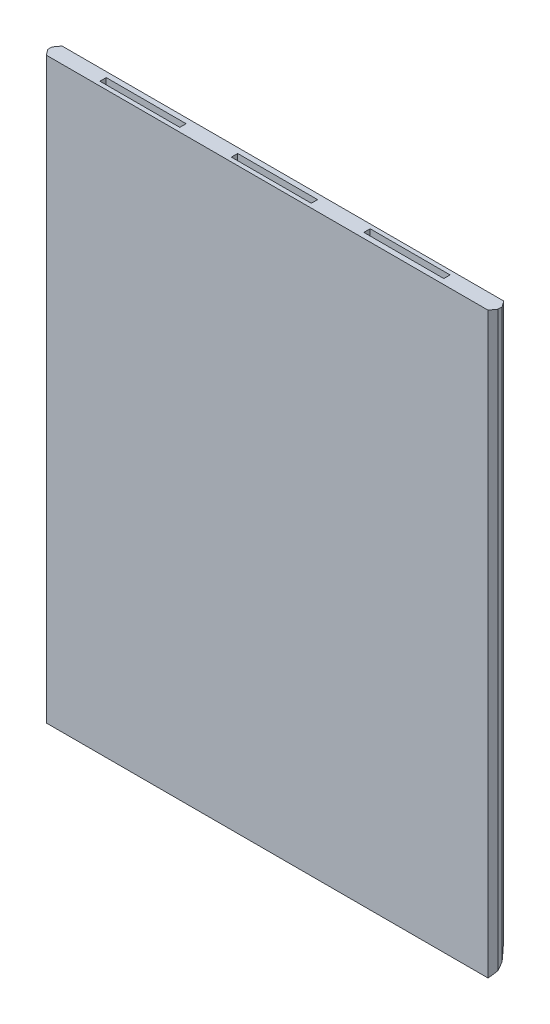
ISO-10303-21;
HEADER;
FILE_DESCRIPTION(('STEP AP214'),'2;1');
FILE_NAME('part.step','',(''),(''),'','','');
FILE_SCHEMA(('AUTOMOTIVE_DESIGN { 1 0 10303 214 1 1 1 1 }'));
ENDSEC;
DATA;
#1=APPLICATION_CONTEXT('core data for automotive mechanical design processes');
#2=APPLICATION_PROTOCOL_DEFINITION('international standard','automotive_design',2000,#1);
#3=PRODUCT_CONTEXT('',#1,'mechanical');
#4=PRODUCT('Part','Part','',(#3));
#5=PRODUCT_RELATED_PRODUCT_CATEGORY('part','',(#4));
#6=PRODUCT_DEFINITION_FORMATION('','',#4);
#7=PRODUCT_DEFINITION_CONTEXT('part definition',#1,'design');
#8=PRODUCT_DEFINITION('design','',#6,#7);
#9=PRODUCT_DEFINITION_SHAPE('','',#8);
#10=(LENGTH_UNIT() NAMED_UNIT(*) SI_UNIT(.MILLI.,.METRE.));
#11=(NAMED_UNIT(*) PLANE_ANGLE_UNIT() SI_UNIT($,.RADIAN.));
#12=(NAMED_UNIT(*) SI_UNIT($,.STERADIAN.) SOLID_ANGLE_UNIT());
#13=UNCERTAINTY_MEASURE_WITH_UNIT(LENGTH_MEASURE(1.E-05),#10,'distance_accuracy_value','');
#14=(GEOMETRIC_REPRESENTATION_CONTEXT(3) GLOBAL_UNCERTAINTY_ASSIGNED_CONTEXT((#13)) GLOBAL_UNIT_ASSIGNED_CONTEXT((#10,
#11,#12)) REPRESENTATION_CONTEXT('',''));
#15=CARTESIAN_POINT('',(0.,0.,0.));
#16=DIRECTION('',(0.,0.,1.));
#17=DIRECTION('',(1.,0.,0.));
#18=AXIS2_PLACEMENT_3D('',#15,#16,#17);
#19=CARTESIAN_POINT('',(0.,110.,0.));
#20=DIRECTION('',(0.,1.,0.));
#21=DIRECTION('',(0.,0.,1.));
#22=AXIS2_PLACEMENT_3D('',#19,#20,#21);
#23=PLANE('',#22);
#24=DIRECTION('',(0.,0.,1.));
#25=VECTOR('',#24,1.);
#26=CARTESIAN_POINT('',(-33.4,110.,-44.7999999999999));
#27=LINE('',#26,#25);
#28=CARTESIAN_POINT('',(-33.4,110.,-44.7999999999999));
#29=VERTEX_POINT('',#28);
#30=CARTESIAN_POINT('',(-33.4,110.,-43.5999999999999));
#31=VERTEX_POINT('',#30);
#32=EDGE_CURVE('E54',#29,#31,#27,.T.);
#33=ORIENTED_EDGE('',*,*,#32,.F.);
#34=DIRECTION('',(-1.,0.,0.));
#35=VECTOR('',#34,1.);
#36=CARTESIAN_POINT('',(-33.4,110.,-44.7999999999999));
#37=LINE('',#36,#35);
#38=CARTESIAN_POINT('',(-18.2,110.,-44.7999999999999));
#39=VERTEX_POINT('',#38);
#40=EDGE_CURVE('E199',#39,#29,#37,.T.);
#41=ORIENTED_EDGE('',*,*,#40,.F.);
#42=DIRECTION('',(0.,0.,-1.));
#43=VECTOR('',#42,1.);
#44=CARTESIAN_POINT('',(-18.2,110.,-44.7999999999999));
#45=LINE('',#44,#43);
#46=CARTESIAN_POINT('',(-18.2,110.,-43.5999999999999));
#47=VERTEX_POINT('',#46);
#48=EDGE_CURVE('E205',#47,#39,#45,.T.);
#49=ORIENTED_EDGE('',*,*,#48,.F.);
#50=DIRECTION('',(1.,0.,0.));
#51=VECTOR('',#50,1.);
#52=CARTESIAN_POINT('',(-33.4,110.,-43.5999999999999));
#53=LINE('',#52,#51);
#54=EDGE_CURVE('E214',#31,#47,#53,.T.);
#55=ORIENTED_EDGE('',*,*,#54,.F.);
#56=EDGE_LOOP('',(#33,#41,#49,#55));
#57=FACE_BOUND('',#56,.T.);
#58=DIRECTION('',(0.,0.,1.));
#59=VECTOR('',#58,1.);
#60=CARTESIAN_POINT('',(-8.40000000000001,110.,-44.7999999999999));
#61=LINE('',#60,#59);
#62=CARTESIAN_POINT('',(-8.40000000000001,110.,-44.7999999999999));
#63=VERTEX_POINT('',#62);
#64=CARTESIAN_POINT('',(-8.40000000000001,110.,-43.5999999999999));
#65=VERTEX_POINT('',#64);
#66=EDGE_CURVE('E62',#63,#65,#61,.T.);
#67=ORIENTED_EDGE('',*,*,#66,.F.);
#68=DIRECTION('',(-1.,0.,0.));
#69=VECTOR('',#68,1.);
#70=CARTESIAN_POINT('',(-8.40000000000001,110.,-44.7999999999999));
#71=LINE('',#70,#69);
#72=CARTESIAN_POINT('',(6.79999999999999,110.,-44.7999999999999));
#73=VERTEX_POINT('',#72);
#74=EDGE_CURVE('E235',#73,#63,#71,.T.);
#75=ORIENTED_EDGE('',*,*,#74,.F.);
#76=DIRECTION('',(0.,0.,-1.));
#77=VECTOR('',#76,1.);
#78=CARTESIAN_POINT('',(6.79999999999999,110.,-44.7999999999999));
#79=LINE('',#78,#77);
#80=CARTESIAN_POINT('',(6.79999999999999,110.,-43.5999999999999));
#81=VERTEX_POINT('',#80);
#82=EDGE_CURVE('E255',#81,#73,#79,.T.);
#83=ORIENTED_EDGE('',*,*,#82,.F.);
#84=DIRECTION('',(1.,0.,0.));
#85=VECTOR('',#84,1.);
#86=CARTESIAN_POINT('',(-8.40000000000001,110.,-43.5999999999999));
#87=LINE('',#86,#85);
#88=EDGE_CURVE('E250',#65,#81,#87,.T.);
#89=ORIENTED_EDGE('',*,*,#88,.F.);
#90=EDGE_LOOP('',(#67,#75,#83,#89));
#91=FACE_BOUND('',#90,.T.);
#92=DIRECTION('',(0.,0.,1.));
#93=VECTOR('',#92,1.);
#94=CARTESIAN_POINT('',(16.6,110.,-45.0000000000001));
#95=LINE('',#94,#93);
#96=CARTESIAN_POINT('',(16.6,110.,-45.0000000000001));
#97=VERTEX_POINT('',#96);
#98=CARTESIAN_POINT('',(16.6,110.,-43.8000000000001));
#99=VERTEX_POINT('',#98);
#100=EDGE_CURVE('E289',#97,#99,#95,.T.);
#101=ORIENTED_EDGE('',*,*,#100,.F.);
#102=DIRECTION('',(-1.,0.,0.));
#103=VECTOR('',#102,1.);
#104=CARTESIAN_POINT('',(16.6,110.,-45.0000000000001));
#105=LINE('',#104,#103);
#106=CARTESIAN_POINT('',(31.8,110.,-45.0000000000001));
#107=VERTEX_POINT('',#106);
#108=EDGE_CURVE('E276',#107,#97,#105,.T.);
#109=ORIENTED_EDGE('',*,*,#108,.F.);
#110=DIRECTION('',(0.,0.,-1.));
#111=VECTOR('',#110,1.);
#112=CARTESIAN_POINT('',(31.8,110.,-45.0000000000001));
#113=LINE('',#112,#111);
#114=CARTESIAN_POINT('',(31.8,110.,-43.8000000000001));
#115=VERTEX_POINT('',#114);
#116=EDGE_CURVE('E296',#115,#107,#113,.T.);
#117=ORIENTED_EDGE('',*,*,#116,.F.);
#118=DIRECTION('',(1.,0.,0.));
#119=VECTOR('',#118,1.);
#120=CARTESIAN_POINT('',(16.6,110.,-43.8000000000001));
#121=LINE('',#120,#119);
#122=EDGE_CURVE('E292',#99,#115,#121,.T.);
#123=ORIENTED_EDGE('',*,*,#122,.F.);
#124=EDGE_LOOP('',(#101,#109,#117,#123));
#125=FACE_BOUND('',#124,.T.);
#126=DIRECTION('',(0.588171697675053,0.,0.808736084303183));
#127=VECTOR('',#126,1.);
#128=CARTESIAN_POINT('',(-42.8,110.,-42.7999999999999));
#129=LINE('',#128,#127);
#130=CARTESIAN_POINT('',(-43.6,110.,-43.8999999999999));
#131=VERTEX_POINT('',#130);
#132=CARTESIAN_POINT('',(-42.8,110.,-42.7999999999999));
#133=VERTEX_POINT('',#132);
#134=EDGE_CURVE('E224',#131,#133,#129,.T.);
#135=ORIENTED_EDGE('',*,*,#134,.T.);
#136=DIRECTION('',(1.,0.,0.));
#137=VECTOR('',#136,1.);
#138=CARTESIAN_POINT('',(41.2,110.,-42.8000000000002));
#139=LINE('',#138,#137);
#140=CARTESIAN_POINT('',(41.2,110.,-42.8000000000002));
#141=VERTEX_POINT('',#140);
#142=EDGE_CURVE('E318',#133,#141,#139,.T.);
#143=ORIENTED_EDGE('',*,*,#142,.T.);
#144=DIRECTION('',(0.588171697675045,0.,-0.80873608430319));
#145=VECTOR('',#144,1.);
#146=CARTESIAN_POINT('',(41.2,110.,-42.8000000000002));
#147=LINE('',#146,#145);
#148=CARTESIAN_POINT('',(42.,110.,-43.9000000000002));
#149=VERTEX_POINT('',#148);
#150=EDGE_CURVE('E346',#141,#149,#147,.T.);
#151=ORIENTED_EDGE('',*,*,#150,.T.);
#152=DIRECTION('',(0.,0.,-1.));
#153=VECTOR('',#152,1.);
#154=CARTESIAN_POINT('',(42.,110.,-43.9000000000002));
#155=LINE('',#154,#153);
#156=CARTESIAN_POINT('',(42.,110.,-44.7000000000002));
#157=VERTEX_POINT('',#156);
#158=EDGE_CURVE('E350',#149,#157,#155,.T.);
#159=ORIENTED_EDGE('',*,*,#158,.T.);
#160=DIRECTION('',(-0.58817169767505,0.,-0.808736084303186));
#161=VECTOR('',#160,1.);
#162=CARTESIAN_POINT('',(42.,110.,-44.7000000000002));
#163=LINE('',#162,#161);
#164=CARTESIAN_POINT('',(41.2,110.,-45.8000000000002));
#165=VERTEX_POINT('',#164);
#166=EDGE_CURVE('E354',#157,#165,#163,.T.);
#167=ORIENTED_EDGE('',*,*,#166,.T.);
#168=DIRECTION('',(-1.,0.,0.));
#169=VECTOR('',#168,1.);
#170=CARTESIAN_POINT('',(41.2,110.,-45.8000000000002));
#171=LINE('',#170,#169);
#172=CARTESIAN_POINT('',(-42.8,110.,-45.7999999999999));
#173=VERTEX_POINT('',#172);
#174=EDGE_CURVE('E358',#165,#173,#171,.T.);
#175=ORIENTED_EDGE('',*,*,#174,.T.);
#176=DIRECTION('',(-0.588171697675048,0.,0.808736084303188));
#177=VECTOR('',#176,1.);
#178=CARTESIAN_POINT('',(-43.6,110.,-44.6999999999999));
#179=LINE('',#178,#177);
#180=CARTESIAN_POINT('',(-43.6,110.,-44.6999999999999));
#181=VERTEX_POINT('',#180);
#182=EDGE_CURVE('E362',#173,#181,#179,.T.);
#183=ORIENTED_EDGE('',*,*,#182,.T.);
#184=DIRECTION('',(0.,0.,1.));
#185=VECTOR('',#184,1.);
#186=CARTESIAN_POINT('',(-43.6,110.,-43.8999999999999));
#187=LINE('',#186,#185);
#188=EDGE_CURVE('E366',#181,#131,#187,.T.);
#189=ORIENTED_EDGE('',*,*,#188,.T.);
#190=EDGE_LOOP('',(#135,#143,#151,#159,#167,#175,#183,#189));
#191=FACE_BOUND('',#190,.T.);
#192=ADVANCED_FACE('F37',(#57,#91,#125,#191),#23,.T.);
#193=CARTESIAN_POINT('',(41.2,209.8,-42.8000000000002));
#194=DIRECTION('',(0.,0.,-1.));
#195=DIRECTION('',(-1.,0.,0.));
#196=AXIS2_PLACEMENT_3D('',#193,#194,#195);
#197=PLANE('',#196);
#198=ORIENTED_EDGE('',*,*,#142,.F.);
#199=DIRECTION('',(0.,-1.,0.));
#200=VECTOR('',#199,1.);
#201=CARTESIAN_POINT('',(-42.8,209.8,-42.7999999999999));
#202=LINE('',#201,#200);
#203=CARTESIAN_POINT('',(-42.8,0.,-42.7999999999999));
#204=VERTEX_POINT('',#203);
#205=EDGE_CURVE('E41',#133,#204,#202,.T.);
#206=ORIENTED_EDGE('',*,*,#205,.T.);
#207=DIRECTION('',(1.,0.,0.));
#208=VECTOR('',#207,1.);
#209=CARTESIAN_POINT('',(41.2,0.,-42.8000000000002));
#210=LINE('',#209,#208);
#211=CARTESIAN_POINT('',(41.2,0.,-42.8000000000002));
#212=VERTEX_POINT('',#211);
#213=EDGE_CURVE('E11',#204,#212,#210,.T.);
#214=ORIENTED_EDGE('',*,*,#213,.T.);
#215=DIRECTION('',(0.,-1.,0.));
#216=VECTOR('',#215,1.);
#217=CARTESIAN_POINT('',(41.2,209.8,-42.8000000000002));
#218=LINE('',#217,#216);
#219=EDGE_CURVE('E341',#141,#212,#218,.T.);
#220=ORIENTED_EDGE('',*,*,#219,.F.);
#221=EDGE_LOOP('',(#198,#206,#214,#220));
#222=FACE_BOUND('',#221,.T.);
#223=ADVANCED_FACE('F396',(#222),#197,.F.);
#224=CARTESIAN_POINT('',(41.2,209.8,-42.8000000000002));
#225=DIRECTION('',(-0.80873608430319,0.,-0.588171697675045));
#226=DIRECTION('',(-0.588171697675045,0.,0.80873608430319));
#227=AXIS2_PLACEMENT_3D('',#224,#225,#226);
#228=PLANE('',#227);
#229=ORIENTED_EDGE('',*,*,#150,.F.);
#230=ORIENTED_EDGE('',*,*,#219,.T.);
#231=CARTESIAN_POINT('',(37.5636363636364,6.2449979983984,-37.8000000000001));
#232=DIRECTION('',(-0.80873608430319,0.,-0.588171697675045));
#233=DIRECTION('',(0.588171697675045,0.,-0.80873608430319));
#234=AXIS2_PLACEMENT_3D('',#231,#232,#233);
#235=ELLIPSE('',#234,9.89197855180761,8.);
#236=CARTESIAN_POINT('',(42.,1.06909228055538,-43.9000000000002));
#237=VERTEX_POINT('',#236);
#238=EDGE_CURVE('E322',#212,#237,#235,.F.);
#239=ORIENTED_EDGE('',*,*,#238,.T.);
#240=DIRECTION('',(0.,-1.,0.));
#241=VECTOR('',#240,1.);
#242=CARTESIAN_POINT('',(42.,209.8,-43.9000000000002));
#243=LINE('',#242,#241);
#244=EDGE_CURVE('E375',#149,#237,#243,.T.);
#245=ORIENTED_EDGE('',*,*,#244,.F.);
#246=EDGE_LOOP('',(#229,#230,#239,#245));
#247=FACE_BOUND('',#246,.T.);
#248=ADVANCED_FACE('F407',(#247),#228,.F.);
#249=CARTESIAN_POINT('',(42.,209.8,-43.9000000000002));
#250=DIRECTION('',(-1.,0.,0.));
#251=DIRECTION('',(0.,0.,1.));
#252=AXIS2_PLACEMENT_3D('',#249,#250,#251);
#253=PLANE('',#252);
#254=ORIENTED_EDGE('',*,*,#158,.F.);
#255=ORIENTED_EDGE('',*,*,#244,.T.);
#256=CARTESIAN_POINT('',(42.,6.2449979983984,-37.8000000000002));
#257=DIRECTION('',(-1.,0.,0.));
#258=DIRECTION('',(0.,0.,1.));
#259=AXIS2_PLACEMENT_3D('',#256,#257,#258);
#260=CIRCLE('',#259,8.);
#261=CARTESIAN_POINT('',(42.,2.19654150239895,-44.7000000000002));
#262=VERTEX_POINT('',#261);
#263=EDGE_CURVE('E317',#237,#262,#260,.F.);
#264=ORIENTED_EDGE('',*,*,#263,.T.);
#265=DIRECTION('',(0.,-1.,0.));
#266=VECTOR('',#265,1.);
#267=CARTESIAN_POINT('',(42.,209.8,-44.7000000000002));
#268=LINE('',#267,#266);
#269=EDGE_CURVE('E378',#157,#262,#268,.T.);
#270=ORIENTED_EDGE('',*,*,#269,.F.);
#271=EDGE_LOOP('',(#254,#255,#264,#270));
#272=FACE_BOUND('',#271,.T.);
#273=ADVANCED_FACE('F424',(#272),#253,.F.);
#274=CARTESIAN_POINT('',(42.,209.8,-44.7000000000002));
#275=DIRECTION('',(-0.808736084303186,0.,0.58817169767505));
#276=DIRECTION('',(0.58817169767505,0.,0.808736084303186));
#277=AXIS2_PLACEMENT_3D('',#274,#275,#276);
#278=PLANE('',#277);
#279=ORIENTED_EDGE('',*,*,#166,.F.);
#280=ORIENTED_EDGE('',*,*,#269,.T.);
#281=CARTESIAN_POINT('',(47.0181818181819,6.2449979983984,-37.8000000000002));
#282=DIRECTION('',(-0.808736084303186,0.,0.58817169767505));
#283=DIRECTION('',(0.58817169767505,0.,0.808736084303186));
#284=AXIS2_PLACEMENT_3D('',#281,#282,#283);
#285=ELLIPSE('',#284,9.89197855180761,8.);
#286=CARTESIAN_POINT('',(41.2,6.2449979983984,-45.8000000000002));
#287=VERTEX_POINT('',#286);
#288=EDGE_CURVE('E313',#262,#287,#285,.F.);
#289=ORIENTED_EDGE('',*,*,#288,.T.);
#290=DIRECTION('',(0.,-1.,0.));
#291=VECTOR('',#290,1.);
#292=CARTESIAN_POINT('',(41.2,209.8,-45.8000000000002));
#293=LINE('',#292,#291);
#294=EDGE_CURVE('E381',#165,#287,#293,.T.);
#295=ORIENTED_EDGE('',*,*,#294,.F.);
#296=EDGE_LOOP('',(#279,#280,#289,#295));
#297=FACE_BOUND('',#296,.T.);
#298=ADVANCED_FACE('F422',(#297),#278,.F.);
#299=CARTESIAN_POINT('',(41.2,209.8,-45.8000000000002));
#300=DIRECTION('',(0.,0.,1.));
#301=DIRECTION('',(1.,0.,0.));
#302=AXIS2_PLACEMENT_3D('',#299,#300,#301);
#303=PLANE('',#302);
#304=ORIENTED_EDGE('',*,*,#174,.F.);
#305=ORIENTED_EDGE('',*,*,#294,.T.);
#306=DIRECTION('',(1.,0.,0.));
#307=VECTOR('',#306,1.);
#308=CARTESIAN_POINT('',(41.2,6.24499799839839,-45.8000000000002));
#309=LINE('',#308,#307);
#310=CARTESIAN_POINT('',(-42.8,6.2449979983984,-45.7999999999999));
#311=VERTEX_POINT('',#310);
#312=EDGE_CURVE('E338',#287,#311,#309,.F.);
#313=ORIENTED_EDGE('',*,*,#312,.T.);
#314=DIRECTION('',(0.,-1.,0.));
#315=VECTOR('',#314,1.);
#316=CARTESIAN_POINT('',(-42.8,209.8,-45.7999999999999));
#317=LINE('',#316,#315);
#318=EDGE_CURVE('E384',#173,#311,#317,.T.);
#319=ORIENTED_EDGE('',*,*,#318,.F.);
#320=EDGE_LOOP('',(#304,#305,#313,#319));
#321=FACE_BOUND('',#320,.T.);
#322=ADVANCED_FACE('F419',(#321),#303,.F.);
#323=CARTESIAN_POINT('',(-43.6,209.8,-44.6999999999999));
#324=DIRECTION('',(0.808736084303187,0.,0.588171697675048));
#325=DIRECTION('',(0.588171697675048,0.,-0.808736084303187));
#326=AXIS2_PLACEMENT_3D('',#323,#324,#325);
#327=PLANE('',#326);
#328=ORIENTED_EDGE('',*,*,#182,.F.);
#329=ORIENTED_EDGE('',*,*,#318,.T.);
#330=CARTESIAN_POINT('',(-48.6181818181819,6.2449979983984,-37.7999999999998));
#331=DIRECTION('',(0.808736084303187,0.,0.588171697675048));
#332=DIRECTION('',(0.588171697675048,0.,-0.808736084303187));
#333=AXIS2_PLACEMENT_3D('',#330,#331,#332);
#334=ELLIPSE('',#333,9.89197855180764,8.);
#335=CARTESIAN_POINT('',(-43.6,2.19654150239896,-44.6999999999999));
#336=VERTEX_POINT('',#335);
#337=EDGE_CURVE('E334',#311,#336,#334,.F.);
#338=ORIENTED_EDGE('',*,*,#337,.T.);
#339=DIRECTION('',(0.,-1.,0.));
#340=VECTOR('',#339,1.);
#341=CARTESIAN_POINT('',(-43.6,209.8,-44.6999999999999));
#342=LINE('',#341,#340);
#343=EDGE_CURVE('E387',#181,#336,#342,.T.);
#344=ORIENTED_EDGE('',*,*,#343,.F.);
#345=EDGE_LOOP('',(#328,#329,#338,#344));
#346=FACE_BOUND('',#345,.T.);
#347=ADVANCED_FACE('F425',(#346),#327,.F.);
#348=CARTESIAN_POINT('',(-43.6,209.8,-43.8999999999999));
#349=DIRECTION('',(1.,0.,0.));
#350=DIRECTION('',(0.,0.,-1.));
#351=AXIS2_PLACEMENT_3D('',#348,#349,#350);
#352=PLANE('',#351);
#353=ORIENTED_EDGE('',*,*,#188,.F.);
#354=ORIENTED_EDGE('',*,*,#343,.T.);
#355=CARTESIAN_POINT('',(-43.6,6.2449979983984,-37.7999999999999));
#356=DIRECTION('',(1.,0.,0.));
#357=DIRECTION('',(0.,0.,-1.));
#358=AXIS2_PLACEMENT_3D('',#355,#356,#357);
#359=CIRCLE('',#358,8.);
#360=CARTESIAN_POINT('',(-43.6,1.06909228055538,-43.8999999999999));
#361=VERTEX_POINT('',#360);
#362=EDGE_CURVE('E330',#336,#361,#359,.F.);
#363=ORIENTED_EDGE('',*,*,#362,.T.);
#364=DIRECTION('',(0.,-1.,0.));
#365=VECTOR('',#364,1.);
#366=CARTESIAN_POINT('',(-43.6,209.8,-43.8999999999999));
#367=LINE('',#366,#365);
#368=EDGE_CURVE('E389',#131,#361,#367,.T.);
#369=ORIENTED_EDGE('',*,*,#368,.F.);
#370=EDGE_LOOP('',(#353,#354,#363,#369));
#371=FACE_BOUND('',#370,.T.);
#372=ADVANCED_FACE('F413',(#371),#352,.F.);
#373=CARTESIAN_POINT('',(-42.8,209.8,-42.7999999999999));
#374=DIRECTION('',(0.808736084303183,0.,-0.588171697675053));
#375=DIRECTION('',(-0.588171697675053,0.,-0.808736084303183));
#376=AXIS2_PLACEMENT_3D('',#373,#374,#375);
#377=PLANE('',#376);
#378=ORIENTED_EDGE('',*,*,#134,.F.);
#379=ORIENTED_EDGE('',*,*,#368,.T.);
#380=CARTESIAN_POINT('',(-39.1636363636363,6.2449979983984,-37.7999999999999));
#381=DIRECTION('',(0.808736084303183,0.,-0.588171697675053));
#382=DIRECTION('',(0.588171697675053,0.,0.808736084303183));
#383=AXIS2_PLACEMENT_3D('',#380,#381,#382);
#384=ELLIPSE('',#383,9.89197855180764,8.);
#385=EDGE_CURVE('E326',#361,#204,#384,.F.);
#386=ORIENTED_EDGE('',*,*,#385,.T.);
#387=ORIENTED_EDGE('',*,*,#205,.F.);
#388=EDGE_LOOP('',(#378,#379,#386,#387));
#389=FACE_BOUND('',#388,.T.);
#390=ADVANCED_FACE('F39',(#389),#377,.F.);
#391=CARTESIAN_POINT('',(41.2,6.2449979983984,-37.8000000000002));
#392=DIRECTION('',(1.,0.,0.));
#393=DIRECTION('',(0.,0.,-1.));
#394=AXIS2_PLACEMENT_3D('',#391,#392,#393);
#395=CYLINDRICAL_SURFACE('',#394,8.);
#396=ORIENTED_EDGE('',*,*,#238,.F.);
#397=ORIENTED_EDGE('',*,*,#213,.F.);
#398=ORIENTED_EDGE('',*,*,#385,.F.);
#399=ORIENTED_EDGE('',*,*,#362,.F.);
#400=ORIENTED_EDGE('',*,*,#337,.F.);
#401=ORIENTED_EDGE('',*,*,#312,.F.);
#402=ORIENTED_EDGE('',*,*,#288,.F.);
#403=ORIENTED_EDGE('',*,*,#263,.F.);
#404=EDGE_LOOP('',(#396,#397,#398,#399,#400,#401,#402,#403));
#405=FACE_BOUND('',#404,.T.);
#406=ADVANCED_FACE('F402',(#405),#395,.T.);
#407=CARTESIAN_POINT('',(16.6,101.8,-45.0000000000001));
#408=DIRECTION('',(-1.,0.,0.));
#409=DIRECTION('',(0.,0.,1.));
#410=AXIS2_PLACEMENT_3D('',#407,#408,#409);
#411=PLANE('',#410);
#412=ORIENTED_EDGE('',*,*,#100,.T.);
#413=DIRECTION('',(0.,1.,0.));
#414=VECTOR('',#413,1.);
#415=CARTESIAN_POINT('',(16.6,101.8,-43.8000000000001));
#416=LINE('',#415,#414);
#417=CARTESIAN_POINT('',(16.6,101.8,-43.8000000000001));
#418=VERTEX_POINT('',#417);
#419=EDGE_CURVE('E288',#418,#99,#416,.T.);
#420=ORIENTED_EDGE('',*,*,#419,.F.);
#421=DIRECTION('',(0.,0.,1.));
#422=VECTOR('',#421,1.);
#423=CARTESIAN_POINT('',(16.6,101.8,-45.0000000000001));
#424=LINE('',#423,#422);
#425=CARTESIAN_POINT('',(16.6,101.8,-45.0000000000001));
#426=VERTEX_POINT('',#425);
#427=EDGE_CURVE('E272',#426,#418,#424,.T.);
#428=ORIENTED_EDGE('',*,*,#427,.F.);
#429=DIRECTION('',(0.,1.,0.));
#430=VECTOR('',#429,1.);
#431=CARTESIAN_POINT('',(16.6,101.8,-45.0000000000001));
#432=LINE('',#431,#430);
#433=EDGE_CURVE('E251',#426,#97,#432,.T.);
#434=ORIENTED_EDGE('',*,*,#433,.T.);
#435=EDGE_LOOP('',(#412,#420,#428,#434));
#436=FACE_BOUND('',#435,.T.);
#437=ADVANCED_FACE('F442',(#436),#411,.F.);
#438=CARTESIAN_POINT('',(16.6,101.8,-45.0000000000001));
#439=DIRECTION('',(0.,0.,-1.));
#440=DIRECTION('',(-1.,0.,0.));
#441=AXIS2_PLACEMENT_3D('',#438,#439,#440);
#442=PLANE('',#441);
#443=ORIENTED_EDGE('',*,*,#108,.T.);
#444=ORIENTED_EDGE('',*,*,#433,.F.);
#445=DIRECTION('',(-1.,0.,0.));
#446=VECTOR('',#445,1.);
#447=CARTESIAN_POINT('',(16.6,101.8,-45.0000000000001));
#448=LINE('',#447,#446);
#449=CARTESIAN_POINT('',(31.8,101.8,-45.0000000000001));
#450=VERTEX_POINT('',#449);
#451=EDGE_CURVE('E284',#450,#426,#448,.T.);
#452=ORIENTED_EDGE('',*,*,#451,.F.);
#453=DIRECTION('',(0.,1.,0.));
#454=VECTOR('',#453,1.);
#455=CARTESIAN_POINT('',(31.8,101.8,-45.0000000000001));
#456=LINE('',#455,#454);
#457=EDGE_CURVE('E304',#450,#107,#456,.T.);
#458=ORIENTED_EDGE('',*,*,#457,.T.);
#459=EDGE_LOOP('',(#443,#444,#452,#458));
#460=FACE_BOUND('',#459,.T.);
#461=ADVANCED_FACE('F448',(#460),#442,.F.);
#462=CARTESIAN_POINT('',(31.8,101.8,-45.0000000000001));
#463=DIRECTION('',(1.,0.,0.));
#464=DIRECTION('',(0.,0.,-1.));
#465=AXIS2_PLACEMENT_3D('',#462,#463,#464);
#466=PLANE('',#465);
#467=ORIENTED_EDGE('',*,*,#116,.T.);
#468=ORIENTED_EDGE('',*,*,#457,.F.);
#469=DIRECTION('',(0.,0.,-1.));
#470=VECTOR('',#469,1.);
#471=CARTESIAN_POINT('',(31.8,101.8,-45.0000000000001));
#472=LINE('',#471,#470);
#473=CARTESIAN_POINT('',(31.8,101.8,-43.8000000000001));
#474=VERTEX_POINT('',#473);
#475=EDGE_CURVE('E280',#474,#450,#472,.T.);
#476=ORIENTED_EDGE('',*,*,#475,.F.);
#477=DIRECTION('',(0.,1.,0.));
#478=VECTOR('',#477,1.);
#479=CARTESIAN_POINT('',(31.8,101.8,-43.8000000000001));
#480=LINE('',#479,#478);
#481=EDGE_CURVE('E307',#474,#115,#480,.T.);
#482=ORIENTED_EDGE('',*,*,#481,.T.);
#483=EDGE_LOOP('',(#467,#468,#476,#482));
#484=FACE_BOUND('',#483,.T.);
#485=ADVANCED_FACE('F460',(#484),#466,.F.);
#486=CARTESIAN_POINT('',(16.6,101.8,-43.8000000000001));
#487=DIRECTION('',(0.,0.,1.));
#488=DIRECTION('',(1.,0.,0.));
#489=AXIS2_PLACEMENT_3D('',#486,#487,#488);
#490=PLANE('',#489);
#491=ORIENTED_EDGE('',*,*,#122,.T.);
#492=ORIENTED_EDGE('',*,*,#481,.F.);
#493=DIRECTION('',(1.,0.,0.));
#494=VECTOR('',#493,1.);
#495=CARTESIAN_POINT('',(16.6,101.8,-43.8000000000001));
#496=LINE('',#495,#494);
#497=EDGE_CURVE('E275',#418,#474,#496,.T.);
#498=ORIENTED_EDGE('',*,*,#497,.F.);
#499=ORIENTED_EDGE('',*,*,#419,.T.);
#500=EDGE_LOOP('',(#491,#492,#498,#499));
#501=FACE_BOUND('',#500,.T.);
#502=ADVANCED_FACE('F456',(#501),#490,.F.);
#503=CARTESIAN_POINT('',(0.,101.8,0.));
#504=DIRECTION('',(0.,1.,0.));
#505=DIRECTION('',(0.,0.,1.));
#506=AXIS2_PLACEMENT_3D('',#503,#504,#505);
#507=PLANE('',#506);
#508=ORIENTED_EDGE('',*,*,#427,.T.);
#509=ORIENTED_EDGE('',*,*,#497,.T.);
#510=ORIENTED_EDGE('',*,*,#475,.T.);
#511=ORIENTED_EDGE('',*,*,#451,.T.);
#512=EDGE_LOOP('',(#508,#509,#510,#511));
#513=FACE_BOUND('',#512,.T.);
#514=ADVANCED_FACE('F459',(#513),#507,.T.);
#515=CARTESIAN_POINT('',(-8.40000000000001,101.8,-44.7999999999999));
#516=DIRECTION('',(-1.,0.,0.));
#517=DIRECTION('',(0.,0.,1.));
#518=AXIS2_PLACEMENT_3D('',#515,#516,#517);
#519=PLANE('',#518);
#520=ORIENTED_EDGE('',*,*,#66,.T.);
#521=DIRECTION('',(0.,1.,0.));
#522=VECTOR('',#521,1.);
#523=CARTESIAN_POINT('',(-8.40000000000001,101.8,-43.5999999999999));
#524=LINE('',#523,#522);
#525=CARTESIAN_POINT('',(-8.40000000000001,101.8,-43.5999999999999));
#526=VERTEX_POINT('',#525);
#527=EDGE_CURVE('E247',#526,#65,#524,.T.);
#528=ORIENTED_EDGE('',*,*,#527,.F.);
#529=DIRECTION('',(0.,0.,1.));
#530=VECTOR('',#529,1.);
#531=CARTESIAN_POINT('',(-8.40000000000001,101.8,-44.7999999999999));
#532=LINE('',#531,#530);
#533=CARTESIAN_POINT('',(-8.40000000000001,101.8,-44.7999999999999));
#534=VERTEX_POINT('',#533);
#535=EDGE_CURVE('E230',#534,#526,#532,.T.);
#536=ORIENTED_EDGE('',*,*,#535,.F.);
#537=DIRECTION('',(0.,1.,0.));
#538=VECTOR('',#537,1.);
#539=CARTESIAN_POINT('',(-8.40000000000001,101.8,-44.7999999999999));
#540=LINE('',#539,#538);
#541=EDGE_CURVE('E215',#534,#63,#540,.T.);
#542=ORIENTED_EDGE('',*,*,#541,.T.);
#543=EDGE_LOOP('',(#520,#528,#536,#542));
#544=FACE_BOUND('',#543,.T.);
#545=ADVANCED_FACE('F470',(#544),#519,.F.);
#546=CARTESIAN_POINT('',(-8.40000000000001,101.8,-44.7999999999999));
#547=DIRECTION('',(0.,0.,-1.));
#548=DIRECTION('',(-1.,0.,0.));
#549=AXIS2_PLACEMENT_3D('',#546,#547,#548);
#550=PLANE('',#549);
#551=ORIENTED_EDGE('',*,*,#74,.T.);
#552=ORIENTED_EDGE('',*,*,#541,.F.);
#553=DIRECTION('',(-1.,0.,0.));
#554=VECTOR('',#553,1.);
#555=CARTESIAN_POINT('',(-8.40000000000001,101.8,-44.7999999999999));
#556=LINE('',#555,#554);
#557=CARTESIAN_POINT('',(6.79999999999999,101.8,-44.7999999999999));
#558=VERTEX_POINT('',#557);
#559=EDGE_CURVE('E243',#558,#534,#556,.T.);
#560=ORIENTED_EDGE('',*,*,#559,.F.);
#561=DIRECTION('',(0.,1.,0.));
#562=VECTOR('',#561,1.);
#563=CARTESIAN_POINT('',(6.79999999999999,101.8,-44.7999999999999));
#564=LINE('',#563,#562);
#565=EDGE_CURVE('E264',#558,#73,#564,.T.);
#566=ORIENTED_EDGE('',*,*,#565,.T.);
#567=EDGE_LOOP('',(#551,#552,#560,#566));
#568=FACE_BOUND('',#567,.T.);
#569=ADVANCED_FACE('F474',(#568),#550,.F.);
#570=CARTESIAN_POINT('',(6.79999999999999,101.8,-44.7999999999999));
#571=DIRECTION('',(1.,0.,0.));
#572=DIRECTION('',(0.,0.,-1.));
#573=AXIS2_PLACEMENT_3D('',#570,#571,#572);
#574=PLANE('',#573);
#575=ORIENTED_EDGE('',*,*,#82,.T.);
#576=ORIENTED_EDGE('',*,*,#565,.F.);
#577=DIRECTION('',(0.,0.,-1.));
#578=VECTOR('',#577,1.);
#579=CARTESIAN_POINT('',(6.79999999999999,101.8,-44.7999999999999));
#580=LINE('',#579,#578);
#581=CARTESIAN_POINT('',(6.79999999999999,101.8,-43.5999999999999));
#582=VERTEX_POINT('',#581);
#583=EDGE_CURVE('E239',#582,#558,#580,.T.);
#584=ORIENTED_EDGE('',*,*,#583,.F.);
#585=DIRECTION('',(0.,1.,0.));
#586=VECTOR('',#585,1.);
#587=CARTESIAN_POINT('',(6.79999999999999,101.8,-43.5999999999999));
#588=LINE('',#587,#586);
#589=EDGE_CURVE('E267',#582,#81,#588,.T.);
#590=ORIENTED_EDGE('',*,*,#589,.T.);
#591=EDGE_LOOP('',(#575,#576,#584,#590));
#592=FACE_BOUND('',#591,.T.);
#593=ADVANCED_FACE('F479',(#592),#574,.F.);
#594=CARTESIAN_POINT('',(-8.40000000000001,101.8,-43.5999999999999));
#595=DIRECTION('',(0.,0.,1.));
#596=DIRECTION('',(1.,0.,0.));
#597=AXIS2_PLACEMENT_3D('',#594,#595,#596);
#598=PLANE('',#597);
#599=ORIENTED_EDGE('',*,*,#88,.T.);
#600=ORIENTED_EDGE('',*,*,#589,.F.);
#601=DIRECTION('',(1.,0.,0.));
#602=VECTOR('',#601,1.);
#603=CARTESIAN_POINT('',(-8.40000000000001,101.8,-43.5999999999999));
#604=LINE('',#603,#602);
#605=EDGE_CURVE('E234',#526,#582,#604,.T.);
#606=ORIENTED_EDGE('',*,*,#605,.F.);
#607=ORIENTED_EDGE('',*,*,#527,.T.);
#608=EDGE_LOOP('',(#599,#600,#606,#607));
#609=FACE_BOUND('',#608,.T.);
#610=ADVANCED_FACE('F475',(#609),#598,.F.);
#611=CARTESIAN_POINT('',(0.,101.8,0.));
#612=DIRECTION('',(0.,1.,0.));
#613=DIRECTION('',(0.,0.,1.));
#614=AXIS2_PLACEMENT_3D('',#611,#612,#613);
#615=PLANE('',#614);
#616=ORIENTED_EDGE('',*,*,#535,.T.);
#617=ORIENTED_EDGE('',*,*,#605,.T.);
#618=ORIENTED_EDGE('',*,*,#583,.T.);
#619=ORIENTED_EDGE('',*,*,#559,.T.);
#620=EDGE_LOOP('',(#616,#617,#618,#619));
#621=FACE_BOUND('',#620,.T.);
#622=ADVANCED_FACE('F478',(#621),#615,.T.);
#623=CARTESIAN_POINT('',(-33.4,101.8,-44.7999999999999));
#624=DIRECTION('',(-1.,0.,0.));
#625=DIRECTION('',(0.,0.,1.));
#626=AXIS2_PLACEMENT_3D('',#623,#624,#625);
#627=PLANE('',#626);
#628=ORIENTED_EDGE('',*,*,#32,.T.);
#629=DIRECTION('',(0.,1.,0.));
#630=VECTOR('',#629,1.);
#631=CARTESIAN_POINT('',(-33.4,101.8,-43.5999999999999));
#632=LINE('',#631,#630);
#633=CARTESIAN_POINT('',(-33.4,101.8,-43.5999999999999));
#634=VERTEX_POINT('',#633);
#635=EDGE_CURVE('E174',#634,#31,#632,.T.);
#636=ORIENTED_EDGE('',*,*,#635,.F.);
#637=DIRECTION('',(0.,0.,1.));
#638=VECTOR('',#637,1.);
#639=CARTESIAN_POINT('',(-33.4,101.8,-44.7999999999999));
#640=LINE('',#639,#638);
#641=CARTESIAN_POINT('',(-33.4,101.8,-44.7999999999999));
#642=VERTEX_POINT('',#641);
#643=EDGE_CURVE('E178',#642,#634,#640,.T.);
#644=ORIENTED_EDGE('',*,*,#643,.F.);
#645=DIRECTION('',(0.,1.,0.));
#646=VECTOR('',#645,1.);
#647=CARTESIAN_POINT('',(-33.4,101.8,-44.7999999999999));
#648=LINE('',#647,#646);
#649=EDGE_CURVE('E221',#642,#29,#648,.T.);
#650=ORIENTED_EDGE('',*,*,#649,.T.);
#651=EDGE_LOOP('',(#628,#636,#644,#650));
#652=FACE_BOUND('',#651,.T.);
#653=ADVANCED_FACE('F176',(#652),#627,.F.);
#654=CARTESIAN_POINT('',(-33.4,101.8,-44.7999999999999));
#655=DIRECTION('',(0.,0.,-1.));
#656=DIRECTION('',(-1.,0.,0.));
#657=AXIS2_PLACEMENT_3D('',#654,#655,#656);
#658=PLANE('',#657);
#659=ORIENTED_EDGE('',*,*,#40,.T.);
#660=ORIENTED_EDGE('',*,*,#649,.F.);
#661=DIRECTION('',(-1.,0.,0.));
#662=VECTOR('',#661,1.);
#663=CARTESIAN_POINT('',(-33.4,101.8,-44.7999999999999));
#664=LINE('',#663,#662);
#665=CARTESIAN_POINT('',(-18.2,101.8,-44.7999999999999));
#666=VERTEX_POINT('',#665);
#667=EDGE_CURVE('E185',#666,#642,#664,.T.);
#668=ORIENTED_EDGE('',*,*,#667,.F.);
#669=DIRECTION('',(0.,1.,0.));
#670=VECTOR('',#669,1.);
#671=CARTESIAN_POINT('',(-18.2,101.8,-44.7999999999999));
#672=LINE('',#671,#670);
#673=EDGE_CURVE('E225',#666,#39,#672,.T.);
#674=ORIENTED_EDGE('',*,*,#673,.T.);
#675=EDGE_LOOP('',(#659,#660,#668,#674));
#676=FACE_BOUND('',#675,.T.);
#677=ADVANCED_FACE('F492',(#676),#658,.F.);
#678=CARTESIAN_POINT('',(-18.2,101.8,-44.7999999999999));
#679=DIRECTION('',(1.,0.,0.));
#680=DIRECTION('',(0.,0.,-1.));
#681=AXIS2_PLACEMENT_3D('',#678,#679,#680);
#682=PLANE('',#681);
#683=ORIENTED_EDGE('',*,*,#48,.T.);
#684=ORIENTED_EDGE('',*,*,#673,.F.);
#685=DIRECTION('',(0.,0.,-1.));
#686=VECTOR('',#685,1.);
#687=CARTESIAN_POINT('',(-18.2,101.8,-44.7999999999999));
#688=LINE('',#687,#686);
#689=CARTESIAN_POINT('',(-18.2,101.8,-43.5999999999999));
#690=VERTEX_POINT('',#689);
#691=EDGE_CURVE('E194',#690,#666,#688,.T.);
#692=ORIENTED_EDGE('',*,*,#691,.F.);
#693=DIRECTION('',(0.,1.,0.));
#694=VECTOR('',#693,1.);
#695=CARTESIAN_POINT('',(-18.2,101.8,-43.5999999999999));
#696=LINE('',#695,#694);
#697=EDGE_CURVE('E184',#690,#47,#696,.T.);
#698=ORIENTED_EDGE('',*,*,#697,.T.);
#699=EDGE_LOOP('',(#683,#684,#692,#698));
#700=FACE_BOUND('',#699,.T.);
#701=ADVANCED_FACE('F495',(#700),#682,.F.);
#702=CARTESIAN_POINT('',(-33.4,101.8,-43.5999999999999));
#703=DIRECTION('',(0.,0.,1.));
#704=DIRECTION('',(1.,0.,0.));
#705=AXIS2_PLACEMENT_3D('',#702,#703,#704);
#706=PLANE('',#705);
#707=ORIENTED_EDGE('',*,*,#54,.T.);
#708=ORIENTED_EDGE('',*,*,#697,.F.);
#709=DIRECTION('',(1.,0.,0.));
#710=VECTOR('',#709,1.);
#711=CARTESIAN_POINT('',(-33.4,101.8,-43.5999999999999));
#712=LINE('',#711,#710);
#713=EDGE_CURVE('E188',#634,#690,#712,.T.);
#714=ORIENTED_EDGE('',*,*,#713,.F.);
#715=ORIENTED_EDGE('',*,*,#635,.T.);
#716=EDGE_LOOP('',(#707,#708,#714,#715));
#717=FACE_BOUND('',#716,.T.);
#718=ADVANCED_FACE('F189',(#717),#706,.F.);
#719=CARTESIAN_POINT('',(0.,101.8,0.));
#720=DIRECTION('',(0.,1.,0.));
#721=DIRECTION('',(0.,0.,1.));
#722=AXIS2_PLACEMENT_3D('',#719,#720,#721);
#723=PLANE('',#722);
#724=ORIENTED_EDGE('',*,*,#643,.T.);
#725=ORIENTED_EDGE('',*,*,#713,.T.);
#726=ORIENTED_EDGE('',*,*,#691,.T.);
#727=ORIENTED_EDGE('',*,*,#667,.T.);
#728=EDGE_LOOP('',(#724,#725,#726,#727));
#729=FACE_BOUND('',#728,.T.);
#730=ADVANCED_FACE('F196',(#729),#723,.T.);
#731=CLOSED_SHELL('',(#192,#223,#248,#273,#298,#322,#347,#372,#390,#406,#437,#461,#485,#502,
#514,#545,#569,#593,#610,#622,#653,#677,#701,#718,#730));
#732=MANIFOLD_SOLID_BREP('B2',#731);
#733=ADVANCED_BREP_SHAPE_REPRESENTATION('',(#18,#732),#14);
#734=SHAPE_DEFINITION_REPRESENTATION(#9,#733);
ENDSEC;
END-ISO-10303-21;
